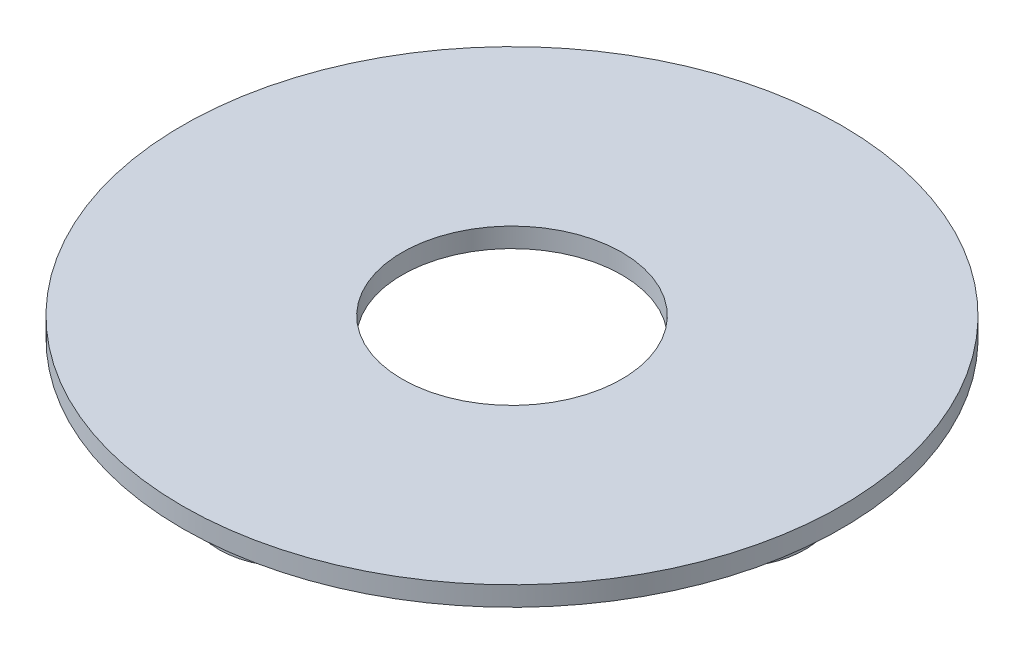
ISO-10303-21;
HEADER;
FILE_DESCRIPTION(('STEP AP214'),'2;1');
FILE_NAME('part.step','',(''),(''),'','','');
FILE_SCHEMA(('AUTOMOTIVE_DESIGN { 1 0 10303 214 1 1 1 1 }'));
ENDSEC;
DATA;
#1=APPLICATION_CONTEXT('core data for automotive mechanical design processes');
#2=APPLICATION_PROTOCOL_DEFINITION('international standard','automotive_design',2000,#1);
#3=PRODUCT_CONTEXT('',#1,'mechanical');
#4=PRODUCT('Part','Part','',(#3));
#5=PRODUCT_RELATED_PRODUCT_CATEGORY('part','',(#4));
#6=PRODUCT_DEFINITION_FORMATION('','',#4);
#7=PRODUCT_DEFINITION_CONTEXT('part definition',#1,'design');
#8=PRODUCT_DEFINITION('design','',#6,#7);
#9=PRODUCT_DEFINITION_SHAPE('','',#8);
#10=(LENGTH_UNIT() NAMED_UNIT(*) SI_UNIT(.MILLI.,.METRE.));
#11=(NAMED_UNIT(*) PLANE_ANGLE_UNIT() SI_UNIT($,.RADIAN.));
#12=(NAMED_UNIT(*) SI_UNIT($,.STERADIAN.) SOLID_ANGLE_UNIT());
#13=UNCERTAINTY_MEASURE_WITH_UNIT(LENGTH_MEASURE(1.E-05),#10,'distance_accuracy_value','');
#14=(GEOMETRIC_REPRESENTATION_CONTEXT(3) GLOBAL_UNCERTAINTY_ASSIGNED_CONTEXT((#13)) GLOBAL_UNIT_ASSIGNED_CONTEXT((#10,
#11,#12)) REPRESENTATION_CONTEXT('',''));
#15=CARTESIAN_POINT('',(0.,0.,0.));
#16=DIRECTION('',(0.,0.,1.));
#17=DIRECTION('',(1.,0.,0.));
#18=AXIS2_PLACEMENT_3D('',#15,#16,#17);
#19=CARTESIAN_POINT('',(0.,0.4,0.));
#20=DIRECTION('',(0.,1.,0.));
#21=DIRECTION('',(0.,0.,1.));
#22=AXIS2_PLACEMENT_3D('',#19,#20,#21);
#23=PLANE('',#22);
#24=CARTESIAN_POINT('',(0.,0.4,0.));
#25=DIRECTION('',(0.,1.,0.));
#26=DIRECTION('',(0.,0.,1.));
#27=AXIS2_PLACEMENT_3D('',#24,#25,#26);
#28=CIRCLE('',#27,13.5);
#29=CARTESIAN_POINT('',(0.,0.4,13.5));
#30=VERTEX_POINT('',#29);
#31=EDGE_CURVE('E11',#30,#30,#28,.T.);
#32=ORIENTED_EDGE('',*,*,#31,.T.);
#33=EDGE_LOOP('',(#32));
#34=FACE_BOUND('',#33,.T.);
#35=CARTESIAN_POINT('',(0.,0.4,0.));
#36=DIRECTION('',(0.,1.,0.));
#37=DIRECTION('',(0.,0.,1.));
#38=AXIS2_PLACEMENT_3D('',#35,#36,#37);
#39=CIRCLE('',#38,4.5);
#40=CARTESIAN_POINT('',(0.,0.4,4.5));
#41=VERTEX_POINT('',#40);
#42=EDGE_CURVE('E67',#41,#41,#39,.T.);
#43=ORIENTED_EDGE('',*,*,#42,.F.);
#44=EDGE_LOOP('',(#43));
#45=FACE_BOUND('',#44,.T.);
#46=ADVANCED_FACE('F49',(#34,#45),#23,.T.);
#47=CARTESIAN_POINT('',(0.,-0.4,0.));
#48=DIRECTION('',(0.,1.,0.));
#49=DIRECTION('',(0.,0.,1.));
#50=AXIS2_PLACEMENT_3D('',#47,#48,#49);
#51=PLANE('',#50);
#52=CARTESIAN_POINT('',(-9.,-0.399999999999999,0.));
#53=DIRECTION('',(0.,1.,0.));
#54=DIRECTION('',(0.,0.,1.));
#55=AXIS2_PLACEMENT_3D('',#52,#53,#54);
#56=CIRCLE('',#55,3.);
#57=CARTESIAN_POINT('',(-9.,-0.399999999999999,3.));
#58=VERTEX_POINT('',#57);
#59=EDGE_CURVE('E53',#58,#58,#56,.T.);
#60=ORIENTED_EDGE('',*,*,#59,.T.);
#61=EDGE_LOOP('',(#60));
#62=FACE_BOUND('',#61,.T.);
#63=CARTESIAN_POINT('',(0.,-0.399999999999999,9.));
#64=DIRECTION('',(0.,1.,0.));
#65=DIRECTION('',(0.,0.,1.));
#66=AXIS2_PLACEMENT_3D('',#63,#64,#65);
#67=CIRCLE('',#66,3.);
#68=CARTESIAN_POINT('',(0.,-0.399999999999999,12.));
#69=VERTEX_POINT('',#68);
#70=EDGE_CURVE('E82',#69,#69,#67,.T.);
#71=ORIENTED_EDGE('',*,*,#70,.T.);
#72=EDGE_LOOP('',(#71));
#73=FACE_BOUND('',#72,.T.);
#74=CARTESIAN_POINT('',(9.,-0.399999999999999,0.));
#75=DIRECTION('',(0.,1.,0.));
#76=DIRECTION('',(0.,0.,1.));
#77=AXIS2_PLACEMENT_3D('',#74,#75,#76);
#78=CIRCLE('',#77,3.);
#79=CARTESIAN_POINT('',(9.,-0.399999999999999,3.));
#80=VERTEX_POINT('',#79);
#81=EDGE_CURVE('E78',#80,#80,#78,.T.);
#82=ORIENTED_EDGE('',*,*,#81,.T.);
#83=EDGE_LOOP('',(#82));
#84=FACE_BOUND('',#83,.T.);
#85=CARTESIAN_POINT('',(0.,-0.399999999999999,-9.));
#86=DIRECTION('',(0.,1.,0.));
#87=DIRECTION('',(0.,0.,1.));
#88=AXIS2_PLACEMENT_3D('',#85,#86,#87);
#89=CIRCLE('',#88,3.);
#90=CARTESIAN_POINT('',(0.,-0.399999999999999,-6.));
#91=VERTEX_POINT('',#90);
#92=EDGE_CURVE('E73',#91,#91,#89,.T.);
#93=ORIENTED_EDGE('',*,*,#92,.T.);
#94=EDGE_LOOP('',(#93));
#95=FACE_BOUND('',#94,.T.);
#96=CARTESIAN_POINT('',(0.,-0.4,0.));
#97=DIRECTION('',(0.,1.,0.));
#98=DIRECTION('',(0.,0.,1.));
#99=AXIS2_PLACEMENT_3D('',#96,#97,#98);
#100=CIRCLE('',#99,13.5);
#101=CARTESIAN_POINT('',(0.,-0.4,13.5));
#102=VERTEX_POINT('',#101);
#103=EDGE_CURVE('E58',#102,#102,#100,.T.);
#104=ORIENTED_EDGE('',*,*,#103,.F.);
#105=EDGE_LOOP('',(#104));
#106=FACE_BOUND('',#105,.T.);
#107=CARTESIAN_POINT('',(0.,-0.4,0.));
#108=DIRECTION('',(0.,1.,0.));
#109=DIRECTION('',(0.,0.,1.));
#110=AXIS2_PLACEMENT_3D('',#107,#108,#109);
#111=CIRCLE('',#110,4.5);
#112=CARTESIAN_POINT('',(0.,-0.4,4.5));
#113=VERTEX_POINT('',#112);
#114=EDGE_CURVE('E70',#113,#113,#111,.T.);
#115=ORIENTED_EDGE('',*,*,#114,.T.);
#116=EDGE_LOOP('',(#115));
#117=FACE_BOUND('',#116,.T.);
#118=ADVANCED_FACE('F113',(#62,#73,#84,#95,#106,#117),#51,.F.);
#119=CARTESIAN_POINT('',(0.,0.4,0.));
#120=DIRECTION('',(0.,-1.,0.));
#121=DIRECTION('',(0.,0.,-1.));
#122=AXIS2_PLACEMENT_3D('',#119,#120,#121);
#123=CYLINDRICAL_SURFACE('',#122,13.5);
#124=ORIENTED_EDGE('',*,*,#31,.F.);
#125=EDGE_LOOP('',(#124));
#126=FACE_BOUND('',#125,.T.);
#127=ORIENTED_EDGE('',*,*,#103,.T.);
#128=EDGE_LOOP('',(#127));
#129=FACE_BOUND('',#128,.T.);
#130=ADVANCED_FACE('F51',(#126,#129),#123,.T.);
#131=CARTESIAN_POINT('',(0.,0.4,0.));
#132=DIRECTION('',(0.,-1.,0.));
#133=DIRECTION('',(0.,0.,-1.));
#134=AXIS2_PLACEMENT_3D('',#131,#132,#133);
#135=CYLINDRICAL_SURFACE('',#134,4.5);
#136=ORIENTED_EDGE('',*,*,#42,.T.);
#137=EDGE_LOOP('',(#136));
#138=FACE_BOUND('',#137,.T.);
#139=ORIENTED_EDGE('',*,*,#114,.F.);
#140=EDGE_LOOP('',(#139));
#141=FACE_BOUND('',#140,.T.);
#142=ADVANCED_FACE('F115',(#138,#141),#135,.F.);
#143=CARTESIAN_POINT('',(0.,-11.8852813742386,-9.));
#144=DIRECTION('',(0.,1.,0.));
#145=DIRECTION('',(0.,0.,1.));
#146=AXIS2_PLACEMENT_3D('',#143,#144,#145);
#147=CYLINDRICAL_SURFACE('',#146,3.);
#148=CARTESIAN_POINT('',(0.,-1.9,-9.));
#149=DIRECTION('',(0.,1.,0.));
#150=DIRECTION('',(0.,0.,1.));
#151=AXIS2_PLACEMENT_3D('',#148,#149,#150);
#152=CIRCLE('',#151,3.);
#153=CARTESIAN_POINT('',(0.,-1.9,-6.));
#154=VERTEX_POINT('',#153);
#155=EDGE_CURVE('E77',#154,#154,#152,.F.);
#156=ORIENTED_EDGE('',*,*,#155,.F.);
#157=EDGE_LOOP('',(#156));
#158=FACE_BOUND('',#157,.T.);
#159=ORIENTED_EDGE('',*,*,#92,.F.);
#160=EDGE_LOOP('',(#159));
#161=FACE_BOUND('',#160,.T.);
#162=ADVANCED_FACE('F117',(#158,#161),#147,.T.);
#163=CARTESIAN_POINT('',(0.,-1.9,0.));
#164=DIRECTION('',(0.,1.,0.));
#165=DIRECTION('',(0.,0.,1.));
#166=AXIS2_PLACEMENT_3D('',#163,#164,#165);
#167=PLANE('',#166);
#168=ORIENTED_EDGE('',*,*,#155,.T.);
#169=EDGE_LOOP('',(#168));
#170=FACE_BOUND('',#169,.T.);
#171=ADVANCED_FACE('F122',(#170),#167,.F.);
#172=CARTESIAN_POINT('',(9.,-11.8852813742386,0.));
#173=DIRECTION('',(0.,1.,0.));
#174=DIRECTION('',(0.,0.,1.));
#175=AXIS2_PLACEMENT_3D('',#172,#173,#174);
#176=CYLINDRICAL_SURFACE('',#175,3.);
#177=CARTESIAN_POINT('',(9.,-1.9,0.));
#178=DIRECTION('',(0.,1.,0.));
#179=DIRECTION('',(0.,0.,1.));
#180=AXIS2_PLACEMENT_3D('',#177,#178,#179);
#181=CIRCLE('',#180,3.);
#182=CARTESIAN_POINT('',(9.,-1.9,3.));
#183=VERTEX_POINT('',#182);
#184=EDGE_CURVE('E81',#183,#183,#181,.F.);
#185=ORIENTED_EDGE('',*,*,#184,.F.);
#186=EDGE_LOOP('',(#185));
#187=FACE_BOUND('',#186,.T.);
#188=ORIENTED_EDGE('',*,*,#81,.F.);
#189=EDGE_LOOP('',(#188));
#190=FACE_BOUND('',#189,.T.);
#191=ADVANCED_FACE('F143',(#187,#190),#176,.T.);
#192=CARTESIAN_POINT('',(0.,-1.9,0.));
#193=DIRECTION('',(0.,1.,0.));
#194=DIRECTION('',(0.,0.,1.));
#195=AXIS2_PLACEMENT_3D('',#192,#193,#194);
#196=PLANE('',#195);
#197=ORIENTED_EDGE('',*,*,#184,.T.);
#198=EDGE_LOOP('',(#197));
#199=FACE_BOUND('',#198,.T.);
#200=ADVANCED_FACE('F145',(#199),#196,.F.);
#201=CARTESIAN_POINT('',(0.,-11.8852813742386,9.));
#202=DIRECTION('',(0.,1.,0.));
#203=DIRECTION('',(0.,0.,1.));
#204=AXIS2_PLACEMENT_3D('',#201,#202,#203);
#205=CYLINDRICAL_SURFACE('',#204,3.);
#206=CARTESIAN_POINT('',(0.,-1.9,9.));
#207=DIRECTION('',(0.,1.,0.));
#208=DIRECTION('',(0.,0.,1.));
#209=AXIS2_PLACEMENT_3D('',#206,#207,#208);
#210=CIRCLE('',#209,3.);
#211=CARTESIAN_POINT('',(0.,-1.9,12.));
#212=VERTEX_POINT('',#211);
#213=EDGE_CURVE('E85',#212,#212,#210,.F.);
#214=ORIENTED_EDGE('',*,*,#213,.F.);
#215=EDGE_LOOP('',(#214));
#216=FACE_BOUND('',#215,.T.);
#217=ORIENTED_EDGE('',*,*,#70,.F.);
#218=EDGE_LOOP('',(#217));
#219=FACE_BOUND('',#218,.T.);
#220=ADVANCED_FACE('F151',(#216,#219),#205,.T.);
#221=CARTESIAN_POINT('',(0.,-1.9,0.));
#222=DIRECTION('',(0.,1.,0.));
#223=DIRECTION('',(0.,0.,1.));
#224=AXIS2_PLACEMENT_3D('',#221,#222,#223);
#225=PLANE('',#224);
#226=ORIENTED_EDGE('',*,*,#213,.T.);
#227=EDGE_LOOP('',(#226));
#228=FACE_BOUND('',#227,.T.);
#229=ADVANCED_FACE('F158',(#228),#225,.F.);
#230=CARTESIAN_POINT('',(-9.,-11.8852813742386,0.));
#231=DIRECTION('',(0.,1.,0.));
#232=DIRECTION('',(0.,0.,1.));
#233=AXIS2_PLACEMENT_3D('',#230,#231,#232);
#234=CYLINDRICAL_SURFACE('',#233,3.);
#235=CARTESIAN_POINT('',(-9.,-1.9,0.));
#236=DIRECTION('',(0.,1.,0.));
#237=DIRECTION('',(0.,0.,1.));
#238=AXIS2_PLACEMENT_3D('',#235,#236,#237);
#239=CIRCLE('',#238,3.);
#240=CARTESIAN_POINT('',(-9.,-1.9,3.));
#241=VERTEX_POINT('',#240);
#242=EDGE_CURVE('E100',#241,#241,#239,.F.);
#243=ORIENTED_EDGE('',*,*,#242,.F.);
#244=EDGE_LOOP('',(#243));
#245=FACE_BOUND('',#244,.T.);
#246=ORIENTED_EDGE('',*,*,#59,.F.);
#247=EDGE_LOOP('',(#246));
#248=FACE_BOUND('',#247,.T.);
#249=ADVANCED_FACE('F161',(#245,#248),#234,.T.);
#250=CARTESIAN_POINT('',(0.,-1.9,0.));
#251=DIRECTION('',(0.,1.,0.));
#252=DIRECTION('',(0.,0.,1.));
#253=AXIS2_PLACEMENT_3D('',#250,#251,#252);
#254=PLANE('',#253);
#255=ORIENTED_EDGE('',*,*,#242,.T.);
#256=EDGE_LOOP('',(#255));
#257=FACE_BOUND('',#256,.T.);
#258=ADVANCED_FACE('F165',(#257),#254,.F.);
#259=CLOSED_SHELL('',(#46,#118,#130,#142,#162,#171,#191,#200,#220,#229,#249,#258));
#260=MANIFOLD_SOLID_BREP('B2',#259);
#261=ADVANCED_BREP_SHAPE_REPRESENTATION('',(#18,#260),#14);
#262=SHAPE_DEFINITION_REPRESENTATION(#9,#261);
ENDSEC;
END-ISO-10303-21;
